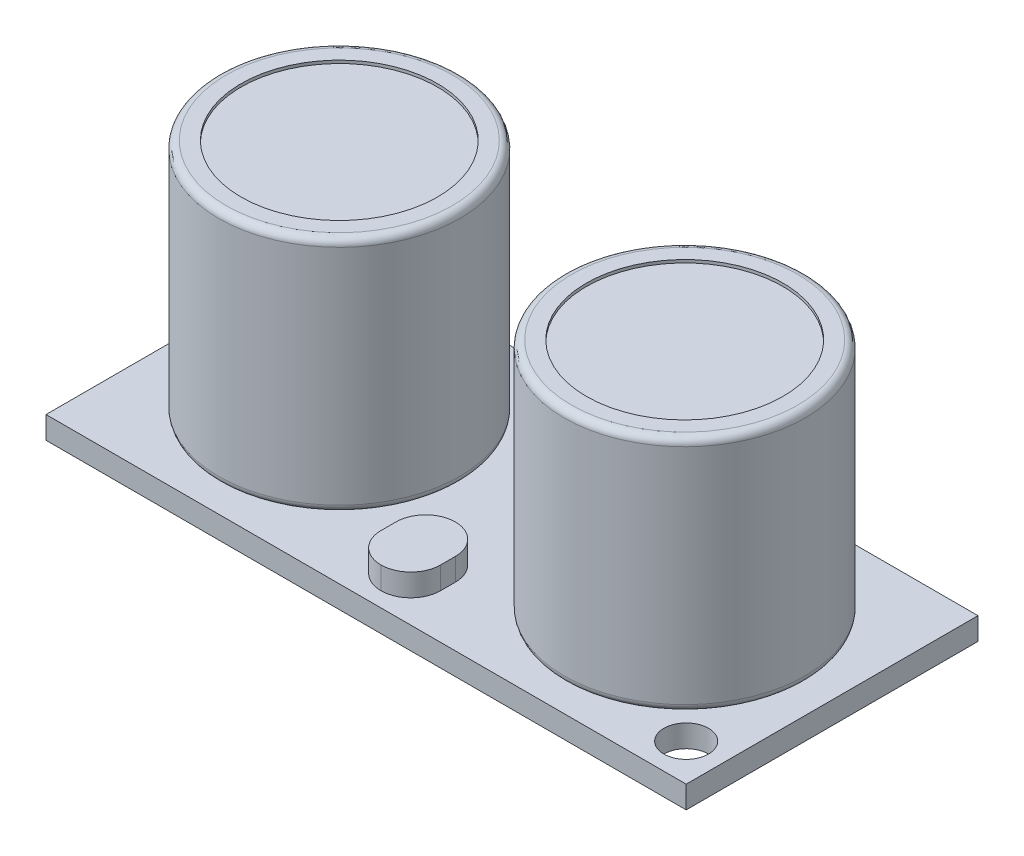
ISO-10303-21;
HEADER;
FILE_DESCRIPTION(('STEP AP214'),'2;1');
FILE_NAME('part.step','',(''),(''),'','','');
FILE_SCHEMA(('AUTOMOTIVE_DESIGN { 1 0 10303 214 1 1 1 1 }'));
ENDSEC;
DATA;
#1=APPLICATION_CONTEXT('core data for automotive mechanical design processes');
#2=APPLICATION_PROTOCOL_DEFINITION('international standard','automotive_design',2000,#1);
#3=PRODUCT_CONTEXT('',#1,'mechanical');
#4=PRODUCT('Part','Part','',(#3));
#5=PRODUCT_RELATED_PRODUCT_CATEGORY('part','',(#4));
#6=PRODUCT_DEFINITION_FORMATION('','',#4);
#7=PRODUCT_DEFINITION_CONTEXT('part definition',#1,'design');
#8=PRODUCT_DEFINITION('design','',#6,#7);
#9=PRODUCT_DEFINITION_SHAPE('','',#8);
#10=(LENGTH_UNIT() NAMED_UNIT(*) SI_UNIT(.MILLI.,.METRE.));
#11=(NAMED_UNIT(*) PLANE_ANGLE_UNIT() SI_UNIT($,.RADIAN.));
#12=(NAMED_UNIT(*) SI_UNIT($,.STERADIAN.) SOLID_ANGLE_UNIT());
#13=UNCERTAINTY_MEASURE_WITH_UNIT(LENGTH_MEASURE(1.E-05),#10,'distance_accuracy_value','');
#14=(GEOMETRIC_REPRESENTATION_CONTEXT(3) GLOBAL_UNCERTAINTY_ASSIGNED_CONTEXT((#13)) GLOBAL_UNIT_ASSIGNED_CONTEXT((#10,
#11,#12)) REPRESENTATION_CONTEXT('',''));
#15=CARTESIAN_POINT('',(0.,0.,0.));
#16=DIRECTION('',(0.,0.,1.));
#17=DIRECTION('',(1.,0.,0.));
#18=AXIS2_PLACEMENT_3D('',#15,#16,#17);
#19=CARTESIAN_POINT('',(-9.9,0.,-9.80000000000001));
#20=DIRECTION('',(0.,1.,0.));
#21=DIRECTION('',(0.,0.,1.));
#22=AXIS2_PLACEMENT_3D('',#19,#20,#21);
#23=PLANE('',#22);
#24=CARTESIAN_POINT('',(30.6,0.,7.3));
#25=DIRECTION('',(0.,-1.,0.));
#26=DIRECTION('',(0.,0.,-1.));
#27=AXIS2_PLACEMENT_3D('',#24,#25,#26);
#28=CIRCLE('',#27,1.5);
#29=CARTESIAN_POINT('',(30.6,0.,5.8));
#30=VERTEX_POINT('',#29);
#31=EDGE_CURVE('E247',#30,#30,#28,.T.);
#32=ORIENTED_EDGE('',*,*,#31,.T.);
#33=EDGE_LOOP('',(#32));
#34=FACE_BOUND('',#33,.T.);
#35=DIRECTION('',(0.,0.,-1.));
#36=VECTOR('',#35,1.);
#37=CARTESIAN_POINT('',(-9.9,0.,9.8));
#38=LINE('',#37,#36);
#39=CARTESIAN_POINT('',(-9.9,0.,9.8));
#40=VERTEX_POINT('',#39);
#41=CARTESIAN_POINT('',(-9.9,0.,-9.80000000000001));
#42=VERTEX_POINT('',#41);
#43=EDGE_CURVE('E116',#40,#42,#38,.T.);
#44=ORIENTED_EDGE('',*,*,#43,.F.);
#45=DIRECTION('',(-1.,0.,0.));
#46=VECTOR('',#45,1.);
#47=CARTESIAN_POINT('',(33.1,0.,9.8));
#48=LINE('',#47,#46);
#49=CARTESIAN_POINT('',(33.1,0.,9.8));
#50=VERTEX_POINT('',#49);
#51=EDGE_CURVE('E144',#50,#40,#48,.T.);
#52=ORIENTED_EDGE('',*,*,#51,.F.);
#53=DIRECTION('',(0.,0.,1.));
#54=VECTOR('',#53,1.);
#55=CARTESIAN_POINT('',(33.1,0.,9.8));
#56=LINE('',#55,#54);
#57=CARTESIAN_POINT('',(33.1,0.,-9.8));
#58=VERTEX_POINT('',#57);
#59=EDGE_CURVE('E117',#58,#50,#56,.T.);
#60=ORIENTED_EDGE('',*,*,#59,.F.);
#61=DIRECTION('',(1.,0.,0.));
#62=VECTOR('',#61,1.);
#63=CARTESIAN_POINT('',(33.1,0.,-9.8));
#64=LINE('',#63,#62);
#65=EDGE_CURVE('E111',#42,#58,#64,.T.);
#66=ORIENTED_EDGE('',*,*,#65,.F.);
#67=EDGE_LOOP('',(#44,#52,#60,#66));
#68=FACE_BOUND('',#67,.T.);
#69=CARTESIAN_POINT('',(-7.4,0.,-7.30000000000001));
#70=DIRECTION('',(0.,-1.,0.));
#71=DIRECTION('',(0.,0.,-1.));
#72=AXIS2_PLACEMENT_3D('',#69,#70,#71);
#73=CIRCLE('',#72,1.5);
#74=CARTESIAN_POINT('',(-7.4,0.,-8.80000000000001));
#75=VERTEX_POINT('',#74);
#76=EDGE_CURVE('E139',#75,#75,#73,.T.);
#77=ORIENTED_EDGE('',*,*,#76,.T.);
#78=EDGE_LOOP('',(#77));
#79=FACE_BOUND('',#78,.T.);
#80=CARTESIAN_POINT('',(0.,0.,0.));
#81=DIRECTION('',(0.,1.,0.));
#82=DIRECTION('',(0.,0.,1.));
#83=AXIS2_PLACEMENT_3D('',#80,#81,#82);
#84=CIRCLE('',#83,7.6);
#85=CARTESIAN_POINT('',(0.,0.,7.6));
#86=VERTEX_POINT('',#85);
#87=EDGE_CURVE('E169',#86,#86,#84,.F.);
#88=ORIENTED_EDGE('',*,*,#87,.T.);
#89=EDGE_LOOP('',(#88));
#90=FACE_BOUND('',#89,.T.);
#91=CARTESIAN_POINT('',(23.2,0.,0.));
#92=DIRECTION('',(0.,1.,0.));
#93=DIRECTION('',(0.,0.,1.));
#94=AXIS2_PLACEMENT_3D('',#91,#92,#93);
#95=CIRCLE('',#94,7.60000000000001);
#96=CARTESIAN_POINT('',(23.2,0.,7.60000000000001));
#97=VERTEX_POINT('',#96);
#98=EDGE_CURVE('E175',#97,#97,#95,.T.);
#99=ORIENTED_EDGE('',*,*,#98,.F.);
#100=EDGE_LOOP('',(#99));
#101=FACE_BOUND('',#100,.T.);
#102=DIRECTION('',(0.,0.,1.));
#103=VECTOR('',#102,1.);
#104=CARTESIAN_POINT('',(13.6,0.,0.));
#105=LINE('',#104,#103);
#106=CARTESIAN_POINT('',(13.6,0.,5.80000000000001));
#107=VERTEX_POINT('',#106);
#108=CARTESIAN_POINT('',(13.6,0.,6.80000000000001));
#109=VERTEX_POINT('',#108);
#110=EDGE_CURVE('E206',#107,#109,#105,.T.);
#111=ORIENTED_EDGE('',*,*,#110,.T.);
#112=CARTESIAN_POINT('',(11.6,0.,6.80000000000001));
#113=DIRECTION('',(0.,1.,0.));
#114=DIRECTION('',(0.,0.,1.));
#115=AXIS2_PLACEMENT_3D('',#112,#113,#114);
#116=CIRCLE('',#115,2.);
#117=CARTESIAN_POINT('',(11.6,0.,8.80000000000001));
#118=VERTEX_POINT('',#117);
#119=EDGE_CURVE('E11',#109,#118,#116,.F.);
#120=ORIENTED_EDGE('',*,*,#119,.T.);
#121=CARTESIAN_POINT('',(11.6,0.,6.80000000000001));
#122=DIRECTION('',(0.,1.,0.));
#123=DIRECTION('',(0.,0.,1.));
#124=AXIS2_PLACEMENT_3D('',#121,#122,#123);
#125=CIRCLE('',#124,2.);
#126=CARTESIAN_POINT('',(9.6,0.,6.80000000000001));
#127=VERTEX_POINT('',#126);
#128=EDGE_CURVE('E43',#118,#127,#125,.F.);
#129=ORIENTED_EDGE('',*,*,#128,.T.);
#130=DIRECTION('',(0.,0.,1.));
#131=VECTOR('',#130,1.);
#132=CARTESIAN_POINT('',(9.6,0.,0.));
#133=LINE('',#132,#131);
#134=CARTESIAN_POINT('',(9.6,0.,5.80000000000001));
#135=VERTEX_POINT('',#134);
#136=EDGE_CURVE('E201',#135,#127,#133,.T.);
#137=ORIENTED_EDGE('',*,*,#136,.F.);
#138=CARTESIAN_POINT('',(11.6,0.,5.80000000000001));
#139=DIRECTION('',(0.,1.,0.));
#140=DIRECTION('',(0.,0.,1.));
#141=AXIS2_PLACEMENT_3D('',#138,#139,#140);
#142=CIRCLE('',#141,2.);
#143=CARTESIAN_POINT('',(11.6,0.,3.80000000000001));
#144=VERTEX_POINT('',#143);
#145=EDGE_CURVE('E56',#135,#144,#142,.F.);
#146=ORIENTED_EDGE('',*,*,#145,.T.);
#147=CARTESIAN_POINT('',(11.6,0.,5.80000000000001));
#148=DIRECTION('',(0.,1.,0.));
#149=DIRECTION('',(0.,0.,1.));
#150=AXIS2_PLACEMENT_3D('',#147,#148,#149);
#151=CIRCLE('',#150,2.);
#152=EDGE_CURVE('E197',#144,#107,#151,.F.);
#153=ORIENTED_EDGE('',*,*,#152,.T.);
#154=EDGE_LOOP('',(#111,#120,#129,#137,#146,#153));
#155=FACE_BOUND('',#154,.T.);
#156=ADVANCED_FACE('F34',(#34,#68,#79,#90,#101,#155),#23,.T.);
#157=CARTESIAN_POINT('',(0.,16.,0.));
#158=DIRECTION('',(0.,-1.,0.));
#159=DIRECTION('',(0.,0.,-1.));
#160=AXIS2_PLACEMENT_3D('',#157,#158,#159);
#161=CYLINDRICAL_SURFACE('',#160,8.1);
#162=CARTESIAN_POINT('',(0.,0.5,0.));
#163=DIRECTION('',(0.,1.,0.));
#164=DIRECTION('',(0.,0.,1.));
#165=AXIS2_PLACEMENT_3D('',#162,#163,#164);
#166=CIRCLE('',#165,8.1);
#167=CARTESIAN_POINT('',(0.,0.5,8.1));
#168=VERTEX_POINT('',#167);
#169=EDGE_CURVE('E166',#168,#168,#166,.T.);
#170=ORIENTED_EDGE('',*,*,#169,.T.);
#171=EDGE_LOOP('',(#170));
#172=FACE_BOUND('',#171,.T.);
#173=CARTESIAN_POINT('',(0.,15.5,0.));
#174=DIRECTION('',(0.,1.,0.));
#175=DIRECTION('',(0.,0.,1.));
#176=AXIS2_PLACEMENT_3D('',#173,#174,#175);
#177=CIRCLE('',#176,8.1);
#178=CARTESIAN_POINT('',(0.,15.5,8.1));
#179=VERTEX_POINT('',#178);
#180=EDGE_CURVE('E163',#179,#179,#177,.F.);
#181=ORIENTED_EDGE('',*,*,#180,.T.);
#182=EDGE_LOOP('',(#181));
#183=FACE_BOUND('',#182,.T.);
#184=ADVANCED_FACE('F274',(#172,#183),#161,.T.);
#185=CARTESIAN_POINT('',(0.,16.,0.));
#186=DIRECTION('',(0.,1.,0.));
#187=DIRECTION('',(0.,0.,1.));
#188=AXIS2_PLACEMENT_3D('',#185,#186,#187);
#189=PLANE('',#188);
#190=CARTESIAN_POINT('',(0.,16.,0.));
#191=DIRECTION('',(0.,1.,0.));
#192=DIRECTION('',(0.,0.,1.));
#193=AXIS2_PLACEMENT_3D('',#190,#191,#192);
#194=CIRCLE('',#193,6.6);
#195=CARTESIAN_POINT('',(0.,16.,6.6));
#196=VERTEX_POINT('',#195);
#197=EDGE_CURVE('E129',#196,#196,#194,.T.);
#198=ORIENTED_EDGE('',*,*,#197,.F.);
#199=EDGE_LOOP('',(#198));
#200=FACE_BOUND('',#199,.T.);
#201=CARTESIAN_POINT('',(0.,16.,0.));
#202=DIRECTION('',(0.,1.,0.));
#203=DIRECTION('',(0.,0.,1.));
#204=AXIS2_PLACEMENT_3D('',#201,#202,#203);
#205=CIRCLE('',#204,7.6);
#206=CARTESIAN_POINT('',(0.,16.,7.6));
#207=VERTEX_POINT('',#206);
#208=EDGE_CURVE('E172',#207,#207,#205,.T.);
#209=ORIENTED_EDGE('',*,*,#208,.T.);
#210=EDGE_LOOP('',(#209));
#211=FACE_BOUND('',#210,.T.);
#212=ADVANCED_FACE('F279',(#200,#211),#189,.T.);
#213=CARTESIAN_POINT('',(0.,0.5,0.));
#214=DIRECTION('',(0.,1.,0.));
#215=DIRECTION('',(0.,0.,1.));
#216=AXIS2_PLACEMENT_3D('',#213,#214,#215);
#217=TOROIDAL_SURFACE('',#216,7.6,0.5);
#218=ORIENTED_EDGE('',*,*,#87,.F.);
#219=EDGE_LOOP('',(#218));
#220=FACE_BOUND('',#219,.T.);
#221=ORIENTED_EDGE('',*,*,#169,.F.);
#222=EDGE_LOOP('',(#221));
#223=FACE_BOUND('',#222,.T.);
#224=ADVANCED_FACE('F305',(#220,#223),#217,.T.);
#225=CARTESIAN_POINT('',(0.,15.5,0.));
#226=DIRECTION('',(0.,1.,0.));
#227=DIRECTION('',(0.,0.,1.));
#228=AXIS2_PLACEMENT_3D('',#225,#226,#227);
#229=TOROIDAL_SURFACE('',#228,7.6,0.5);
#230=ORIENTED_EDGE('',*,*,#180,.F.);
#231=EDGE_LOOP('',(#230));
#232=FACE_BOUND('',#231,.T.);
#233=ORIENTED_EDGE('',*,*,#208,.F.);
#234=EDGE_LOOP('',(#233));
#235=FACE_BOUND('',#234,.T.);
#236=ADVANCED_FACE('F301',(#232,#235),#229,.T.);
#237=CARTESIAN_POINT('',(0.,15.8,0.));
#238=DIRECTION('',(0.,1.,0.));
#239=DIRECTION('',(0.,0.,1.));
#240=AXIS2_PLACEMENT_3D('',#237,#238,#239);
#241=CYLINDRICAL_SURFACE('',#240,6.6);
#242=CARTESIAN_POINT('',(0.,15.8,0.));
#243=DIRECTION('',(0.,1.,0.));
#244=DIRECTION('',(0.,0.,1.));
#245=AXIS2_PLACEMENT_3D('',#242,#243,#244);
#246=CIRCLE('',#245,6.6);
#247=CARTESIAN_POINT('',(0.,15.8,6.6));
#248=VERTEX_POINT('',#247);
#249=EDGE_CURVE('E160',#248,#248,#246,.T.);
#250=ORIENTED_EDGE('',*,*,#249,.F.);
#251=EDGE_LOOP('',(#250));
#252=FACE_BOUND('',#251,.T.);
#253=ORIENTED_EDGE('',*,*,#197,.T.);
#254=EDGE_LOOP('',(#253));
#255=FACE_BOUND('',#254,.T.);
#256=ADVANCED_FACE('F297',(#252,#255),#241,.F.);
#257=CARTESIAN_POINT('',(0.,15.8,0.));
#258=DIRECTION('',(0.,1.,0.));
#259=DIRECTION('',(0.,0.,1.));
#260=AXIS2_PLACEMENT_3D('',#257,#258,#259);
#261=PLANE('',#260);
#262=ORIENTED_EDGE('',*,*,#249,.T.);
#263=EDGE_LOOP('',(#262));
#264=FACE_BOUND('',#263,.T.);
#265=ADVANCED_FACE('F285',(#264),#261,.T.);
#266=CARTESIAN_POINT('',(-9.9,-1.5,-9.80000000000001));
#267=DIRECTION('',(0.,1.,0.));
#268=DIRECTION('',(0.,0.,1.));
#269=AXIS2_PLACEMENT_3D('',#266,#267,#268);
#270=PLANE('',#269);
#271=CARTESIAN_POINT('',(-7.4,-1.5,-7.30000000000001));
#272=DIRECTION('',(0.,-1.,0.));
#273=DIRECTION('',(0.,0.,-1.));
#274=AXIS2_PLACEMENT_3D('',#271,#272,#273);
#275=CIRCLE('',#274,1.5);
#276=CARTESIAN_POINT('',(-7.4,-1.5,-8.80000000000001));
#277=VERTEX_POINT('',#276);
#278=EDGE_CURVE('E136',#277,#277,#275,.T.);
#279=ORIENTED_EDGE('',*,*,#278,.F.);
#280=EDGE_LOOP('',(#279));
#281=FACE_BOUND('',#280,.T.);
#282=DIRECTION('',(0.,0.,-1.));
#283=VECTOR('',#282,1.);
#284=CARTESIAN_POINT('',(-9.9,-1.5,9.8));
#285=LINE('',#284,#283);
#286=CARTESIAN_POINT('',(-9.9,-1.5,9.8));
#287=VERTEX_POINT('',#286);
#288=CARTESIAN_POINT('',(-9.9,-1.5,-9.80000000000001));
#289=VERTEX_POINT('',#288);
#290=EDGE_CURVE('E146',#287,#289,#285,.T.);
#291=ORIENTED_EDGE('',*,*,#290,.T.);
#292=DIRECTION('',(1.,0.,0.));
#293=VECTOR('',#292,1.);
#294=CARTESIAN_POINT('',(33.1,-1.5,-9.8));
#295=LINE('',#294,#293);
#296=CARTESIAN_POINT('',(33.1,-1.5,-9.8));
#297=VERTEX_POINT('',#296);
#298=EDGE_CURVE('E125',#289,#297,#295,.T.);
#299=ORIENTED_EDGE('',*,*,#298,.T.);
#300=DIRECTION('',(0.,0.,1.));
#301=VECTOR('',#300,1.);
#302=CARTESIAN_POINT('',(33.1,-1.5,9.8));
#303=LINE('',#302,#301);
#304=CARTESIAN_POINT('',(33.1,-1.5,9.8));
#305=VERTEX_POINT('',#304);
#306=EDGE_CURVE('E149',#297,#305,#303,.T.);
#307=ORIENTED_EDGE('',*,*,#306,.T.);
#308=DIRECTION('',(-1.,0.,0.));
#309=VECTOR('',#308,1.);
#310=CARTESIAN_POINT('',(33.1,-1.5,9.8));
#311=LINE('',#310,#309);
#312=EDGE_CURVE('E151',#305,#287,#311,.T.);
#313=ORIENTED_EDGE('',*,*,#312,.T.);
#314=EDGE_LOOP('',(#291,#299,#307,#313));
#315=FACE_BOUND('',#314,.T.);
#316=CARTESIAN_POINT('',(30.6,-1.5,7.3));
#317=DIRECTION('',(0.,-1.,0.));
#318=DIRECTION('',(0.,0.,-1.));
#319=AXIS2_PLACEMENT_3D('',#316,#317,#318);
#320=CIRCLE('',#319,1.5);
#321=CARTESIAN_POINT('',(30.6,-1.5,5.8));
#322=VERTEX_POINT('',#321);
#323=EDGE_CURVE('E250',#322,#322,#320,.T.);
#324=ORIENTED_EDGE('',*,*,#323,.F.);
#325=EDGE_LOOP('',(#324));
#326=FACE_BOUND('',#325,.T.);
#327=ADVANCED_FACE('F283',(#281,#315,#326),#270,.F.);
#328=CARTESIAN_POINT('',(-9.9,-1.5,9.8));
#329=DIRECTION('',(1.,0.,0.));
#330=DIRECTION('',(0.,0.,-1.));
#331=AXIS2_PLACEMENT_3D('',#328,#329,#330);
#332=PLANE('',#331);
#333=ORIENTED_EDGE('',*,*,#43,.T.);
#334=DIRECTION('',(0.,1.,0.));
#335=VECTOR('',#334,1.);
#336=CARTESIAN_POINT('',(-9.9,-1.5,-9.80000000000001));
#337=LINE('',#336,#335);
#338=EDGE_CURVE('E123',#289,#42,#337,.T.);
#339=ORIENTED_EDGE('',*,*,#338,.F.);
#340=ORIENTED_EDGE('',*,*,#290,.F.);
#341=DIRECTION('',(0.,1.,0.));
#342=VECTOR('',#341,1.);
#343=CARTESIAN_POINT('',(-9.9,-1.5,9.8));
#344=LINE('',#343,#342);
#345=EDGE_CURVE('E135',#287,#40,#344,.T.);
#346=ORIENTED_EDGE('',*,*,#345,.T.);
#347=EDGE_LOOP('',(#333,#339,#340,#346));
#348=FACE_BOUND('',#347,.T.);
#349=ADVANCED_FACE('F133',(#348),#332,.F.);
#350=CARTESIAN_POINT('',(33.1,-1.5,-9.8));
#351=DIRECTION('',(0.,0.,1.));
#352=DIRECTION('',(1.,0.,0.));
#353=AXIS2_PLACEMENT_3D('',#350,#351,#352);
#354=PLANE('',#353);
#355=ORIENTED_EDGE('',*,*,#65,.T.);
#356=DIRECTION('',(0.,1.,0.));
#357=VECTOR('',#356,1.);
#358=CARTESIAN_POINT('',(33.1,-1.5,-9.8));
#359=LINE('',#358,#357);
#360=EDGE_CURVE('E130',#297,#58,#359,.T.);
#361=ORIENTED_EDGE('',*,*,#360,.F.);
#362=ORIENTED_EDGE('',*,*,#298,.F.);
#363=ORIENTED_EDGE('',*,*,#338,.T.);
#364=EDGE_LOOP('',(#355,#361,#362,#363));
#365=FACE_BOUND('',#364,.T.);
#366=ADVANCED_FACE('F124',(#365),#354,.F.);
#367=CARTESIAN_POINT('',(33.1,-1.5,9.8));
#368=DIRECTION('',(-1.,0.,0.));
#369=DIRECTION('',(0.,0.,1.));
#370=AXIS2_PLACEMENT_3D('',#367,#368,#369);
#371=PLANE('',#370);
#372=ORIENTED_EDGE('',*,*,#59,.T.);
#373=DIRECTION('',(0.,1.,0.));
#374=VECTOR('',#373,1.);
#375=CARTESIAN_POINT('',(33.1,-1.5,9.8));
#376=LINE('',#375,#374);
#377=EDGE_CURVE('E154',#305,#50,#376,.T.);
#378=ORIENTED_EDGE('',*,*,#377,.F.);
#379=ORIENTED_EDGE('',*,*,#306,.F.);
#380=ORIENTED_EDGE('',*,*,#360,.T.);
#381=EDGE_LOOP('',(#372,#378,#379,#380));
#382=FACE_BOUND('',#381,.T.);
#383=ADVANCED_FACE('F269',(#382),#371,.F.);
#384=CARTESIAN_POINT('',(33.1,-1.5,9.8));
#385=DIRECTION('',(0.,0.,-1.));
#386=DIRECTION('',(-1.,0.,0.));
#387=AXIS2_PLACEMENT_3D('',#384,#385,#386);
#388=PLANE('',#387);
#389=ORIENTED_EDGE('',*,*,#51,.T.);
#390=ORIENTED_EDGE('',*,*,#345,.F.);
#391=ORIENTED_EDGE('',*,*,#312,.F.);
#392=ORIENTED_EDGE('',*,*,#377,.T.);
#393=EDGE_LOOP('',(#389,#390,#391,#392));
#394=FACE_BOUND('',#393,.T.);
#395=ADVANCED_FACE('F259',(#394),#388,.F.);
#396=CARTESIAN_POINT('',(-7.4,-1.5,-7.30000000000001));
#397=DIRECTION('',(0.,1.,0.));
#398=DIRECTION('',(0.,0.,1.));
#399=AXIS2_PLACEMENT_3D('',#396,#397,#398);
#400=CYLINDRICAL_SURFACE('',#399,1.5);
#401=ORIENTED_EDGE('',*,*,#278,.T.);
#402=EDGE_LOOP('',(#401));
#403=FACE_BOUND('',#402,.T.);
#404=ORIENTED_EDGE('',*,*,#76,.F.);
#405=EDGE_LOOP('',(#404));
#406=FACE_BOUND('',#405,.T.);
#407=ADVANCED_FACE('F256',(#403,#406),#400,.F.);
#408=CARTESIAN_POINT('',(30.6,-1.5,7.3));
#409=DIRECTION('',(0.,1.,0.));
#410=DIRECTION('',(0.,0.,1.));
#411=AXIS2_PLACEMENT_3D('',#408,#409,#410);
#412=CYLINDRICAL_SURFACE('',#411,1.5);
#413=ORIENTED_EDGE('',*,*,#323,.T.);
#414=EDGE_LOOP('',(#413));
#415=FACE_BOUND('',#414,.T.);
#416=ORIENTED_EDGE('',*,*,#31,.F.);
#417=EDGE_LOOP('',(#416));
#418=FACE_BOUND('',#417,.T.);
#419=ADVANCED_FACE('F258',(#415,#418),#412,.F.);
#420=CARTESIAN_POINT('',(23.2,16.,0.));
#421=DIRECTION('',(0.,-1.,0.));
#422=DIRECTION('',(0.,0.,-1.));
#423=AXIS2_PLACEMENT_3D('',#420,#421,#422);
#424=CYLINDRICAL_SURFACE('',#423,8.10000000000001);
#425=CARTESIAN_POINT('',(23.2,0.5,0.));
#426=DIRECTION('',(0.,1.,0.));
#427=DIRECTION('',(0.,0.,1.));
#428=AXIS2_PLACEMENT_3D('',#425,#426,#427);
#429=CIRCLE('',#428,8.10000000000001);
#430=CARTESIAN_POINT('',(23.2,0.5,8.10000000000001));
#431=VERTEX_POINT('',#430);
#432=EDGE_CURVE('E241',#431,#431,#429,.T.);
#433=ORIENTED_EDGE('',*,*,#432,.T.);
#434=EDGE_LOOP('',(#433));
#435=FACE_BOUND('',#434,.T.);
#436=CARTESIAN_POINT('',(23.2,15.5,0.));
#437=DIRECTION('',(0.,1.,0.));
#438=DIRECTION('',(0.,0.,1.));
#439=AXIS2_PLACEMENT_3D('',#436,#437,#438);
#440=CIRCLE('',#439,8.10000000000001);
#441=CARTESIAN_POINT('',(23.2,15.5,8.10000000000001));
#442=VERTEX_POINT('',#441);
#443=EDGE_CURVE('E238',#442,#442,#440,.F.);
#444=ORIENTED_EDGE('',*,*,#443,.T.);
#445=EDGE_LOOP('',(#444));
#446=FACE_BOUND('',#445,.T.);
#447=ADVANCED_FACE('F266',(#435,#446),#424,.T.);
#448=CARTESIAN_POINT('',(23.2,16.,0.));
#449=DIRECTION('',(0.,1.,0.));
#450=DIRECTION('',(0.,0.,1.));
#451=AXIS2_PLACEMENT_3D('',#448,#449,#450);
#452=PLANE('',#451);
#453=CARTESIAN_POINT('',(23.2,16.,0.));
#454=DIRECTION('',(0.,1.,0.));
#455=DIRECTION('',(0.,0.,1.));
#456=AXIS2_PLACEMENT_3D('',#453,#454,#455);
#457=CIRCLE('',#456,7.60000000000001);
#458=CARTESIAN_POINT('',(23.2,16.,7.60000000000001));
#459=VERTEX_POINT('',#458);
#460=EDGE_CURVE('E244',#459,#459,#457,.T.);
#461=ORIENTED_EDGE('',*,*,#460,.T.);
#462=EDGE_LOOP('',(#461));
#463=FACE_BOUND('',#462,.T.);
#464=CARTESIAN_POINT('',(23.2,16.,0.));
#465=DIRECTION('',(0.,1.,0.));
#466=DIRECTION('',(0.,0.,1.));
#467=AXIS2_PLACEMENT_3D('',#464,#465,#466);
#468=CIRCLE('',#467,6.6);
#469=CARTESIAN_POINT('',(23.2,16.,6.6));
#470=VERTEX_POINT('',#469);
#471=EDGE_CURVE('E227',#470,#470,#468,.T.);
#472=ORIENTED_EDGE('',*,*,#471,.F.);
#473=EDGE_LOOP('',(#472));
#474=FACE_BOUND('',#473,.T.);
#475=ADVANCED_FACE('F385',(#463,#474),#452,.T.);
#476=CARTESIAN_POINT('',(23.2,15.8,0.));
#477=DIRECTION('',(0.,1.,0.));
#478=DIRECTION('',(0.,0.,1.));
#479=AXIS2_PLACEMENT_3D('',#476,#477,#478);
#480=CYLINDRICAL_SURFACE('',#479,6.6);
#481=CARTESIAN_POINT('',(23.2,15.8,0.));
#482=DIRECTION('',(0.,1.,0.));
#483=DIRECTION('',(0.,0.,1.));
#484=AXIS2_PLACEMENT_3D('',#481,#482,#483);
#485=CIRCLE('',#484,6.6);
#486=CARTESIAN_POINT('',(23.2,15.8,6.6));
#487=VERTEX_POINT('',#486);
#488=EDGE_CURVE('E231',#487,#487,#485,.T.);
#489=ORIENTED_EDGE('',*,*,#488,.F.);
#490=EDGE_LOOP('',(#489));
#491=FACE_BOUND('',#490,.T.);
#492=ORIENTED_EDGE('',*,*,#471,.T.);
#493=EDGE_LOOP('',(#492));
#494=FACE_BOUND('',#493,.T.);
#495=ADVANCED_FACE('F377',(#491,#494),#480,.F.);
#496=CARTESIAN_POINT('',(23.2,15.8,0.));
#497=DIRECTION('',(0.,1.,0.));
#498=DIRECTION('',(0.,0.,1.));
#499=AXIS2_PLACEMENT_3D('',#496,#497,#498);
#500=PLANE('',#499);
#501=ORIENTED_EDGE('',*,*,#488,.T.);
#502=EDGE_LOOP('',(#501));
#503=FACE_BOUND('',#502,.T.);
#504=ADVANCED_FACE('F368',(#503),#500,.T.);
#505=CARTESIAN_POINT('',(23.2,0.5,0.));
#506=DIRECTION('',(0.,1.,0.));
#507=DIRECTION('',(0.,0.,1.));
#508=AXIS2_PLACEMENT_3D('',#505,#506,#507);
#509=TOROIDAL_SURFACE('',#508,7.60000000000001,0.5);
#510=ORIENTED_EDGE('',*,*,#98,.T.);
#511=EDGE_LOOP('',(#510));
#512=FACE_BOUND('',#511,.T.);
#513=ORIENTED_EDGE('',*,*,#432,.F.);
#514=EDGE_LOOP('',(#513));
#515=FACE_BOUND('',#514,.T.);
#516=ADVANCED_FACE('F360',(#512,#515),#509,.T.);
#517=CARTESIAN_POINT('',(23.2,15.5,0.));
#518=DIRECTION('',(0.,1.,0.));
#519=DIRECTION('',(0.,0.,1.));
#520=AXIS2_PLACEMENT_3D('',#517,#518,#519);
#521=TOROIDAL_SURFACE('',#520,7.60000000000001,0.5);
#522=ORIENTED_EDGE('',*,*,#443,.F.);
#523=EDGE_LOOP('',(#522));
#524=FACE_BOUND('',#523,.T.);
#525=ORIENTED_EDGE('',*,*,#460,.F.);
#526=EDGE_LOOP('',(#525));
#527=FACE_BOUND('',#526,.T.);
#528=ADVANCED_FACE('F352',(#524,#527),#521,.T.);
#529=CARTESIAN_POINT('',(9.6,1.5,0.));
#530=DIRECTION('',(1.,0.,0.));
#531=DIRECTION('',(0.,0.,-1.));
#532=AXIS2_PLACEMENT_3D('',#529,#530,#531);
#533=PLANE('',#532);
#534=DIRECTION('',(0.,0.,1.));
#535=VECTOR('',#534,1.);
#536=CARTESIAN_POINT('',(9.6,1.5,0.));
#537=LINE('',#536,#535);
#538=CARTESIAN_POINT('',(9.6,1.5,5.80000000000001));
#539=VERTEX_POINT('',#538);
#540=CARTESIAN_POINT('',(9.6,1.5,6.80000000000001));
#541=VERTEX_POINT('',#540);
#542=EDGE_CURVE('E228',#539,#541,#537,.T.);
#543=ORIENTED_EDGE('',*,*,#542,.F.);
#544=DIRECTION('',(0.,-1.,0.));
#545=VECTOR('',#544,1.);
#546=CARTESIAN_POINT('',(9.6,0.,5.80000000000001));
#547=LINE('',#546,#545);
#548=EDGE_CURVE('E181',#539,#135,#547,.T.);
#549=ORIENTED_EDGE('',*,*,#548,.T.);
#550=ORIENTED_EDGE('',*,*,#136,.T.);
#551=DIRECTION('',(0.,-1.,0.));
#552=VECTOR('',#551,1.);
#553=CARTESIAN_POINT('',(9.6,1.5,6.80000000000001));
#554=LINE('',#553,#552);
#555=EDGE_CURVE('E178',#127,#541,#554,.F.);
#556=ORIENTED_EDGE('',*,*,#555,.T.);
#557=EDGE_LOOP('',(#543,#549,#550,#556));
#558=FACE_BOUND('',#557,.T.);
#559=ADVANCED_FACE('F345',(#558),#533,.F.);
#560=CARTESIAN_POINT('',(13.6,1.5,0.));
#561=DIRECTION('',(1.,0.,0.));
#562=DIRECTION('',(0.,0.,-1.));
#563=AXIS2_PLACEMENT_3D('',#560,#561,#562);
#564=PLANE('',#563);
#565=ORIENTED_EDGE('',*,*,#110,.F.);
#566=DIRECTION('',(0.,-1.,0.));
#567=VECTOR('',#566,1.);
#568=CARTESIAN_POINT('',(13.6,1.5,5.80000000000001));
#569=LINE('',#568,#567);
#570=CARTESIAN_POINT('',(13.6,1.5,5.80000000000001));
#571=VERTEX_POINT('',#570);
#572=EDGE_CURVE('E194',#107,#571,#569,.F.);
#573=ORIENTED_EDGE('',*,*,#572,.T.);
#574=DIRECTION('',(0.,0.,1.));
#575=VECTOR('',#574,1.);
#576=CARTESIAN_POINT('',(13.6,1.5,0.));
#577=LINE('',#576,#575);
#578=CARTESIAN_POINT('',(13.6,1.5,6.80000000000001));
#579=VERTEX_POINT('',#578);
#580=EDGE_CURVE('E220',#571,#579,#577,.T.);
#581=ORIENTED_EDGE('',*,*,#580,.T.);
#582=DIRECTION('',(0.,-1.,0.));
#583=VECTOR('',#582,1.);
#584=CARTESIAN_POINT('',(13.6,0.,6.80000000000001));
#585=LINE('',#584,#583);
#586=EDGE_CURVE('E192',#579,#109,#585,.T.);
#587=ORIENTED_EDGE('',*,*,#586,.T.);
#588=EDGE_LOOP('',(#565,#573,#581,#587));
#589=FACE_BOUND('',#588,.T.);
#590=ADVANCED_FACE('F225',(#589),#564,.T.);
#591=CARTESIAN_POINT('',(-25.2982139257747,1.5,0.));
#592=DIRECTION('',(0.,1.,0.));
#593=DIRECTION('',(0.,0.,1.));
#594=AXIS2_PLACEMENT_3D('',#591,#592,#593);
#595=PLANE('',#594);
#596=CARTESIAN_POINT('',(11.6,1.5,5.80000000000001));
#597=DIRECTION('',(0.,1.,0.));
#598=DIRECTION('',(0.,0.,1.));
#599=AXIS2_PLACEMENT_3D('',#596,#597,#598);
#600=CIRCLE('',#599,2.);
#601=CARTESIAN_POINT('',(11.6,1.5,3.80000000000001));
#602=VERTEX_POINT('',#601);
#603=EDGE_CURVE('E188',#571,#602,#600,.T.);
#604=ORIENTED_EDGE('',*,*,#603,.T.);
#605=CARTESIAN_POINT('',(11.6,1.5,5.80000000000001));
#606=DIRECTION('',(0.,1.,0.));
#607=DIRECTION('',(0.,0.,1.));
#608=AXIS2_PLACEMENT_3D('',#605,#606,#607);
#609=CIRCLE('',#608,2.);
#610=EDGE_CURVE('E190',#602,#539,#609,.T.);
#611=ORIENTED_EDGE('',*,*,#610,.T.);
#612=ORIENTED_EDGE('',*,*,#542,.T.);
#613=CARTESIAN_POINT('',(11.6,1.5,6.80000000000001));
#614=DIRECTION('',(0.,1.,0.));
#615=DIRECTION('',(0.,0.,1.));
#616=AXIS2_PLACEMENT_3D('',#613,#614,#615);
#617=CIRCLE('',#616,2.);
#618=CARTESIAN_POINT('',(11.6,1.5,8.80000000000001));
#619=VERTEX_POINT('',#618);
#620=EDGE_CURVE('E186',#541,#619,#617,.T.);
#621=ORIENTED_EDGE('',*,*,#620,.T.);
#622=CARTESIAN_POINT('',(11.6,1.5,6.80000000000001));
#623=DIRECTION('',(0.,1.,0.));
#624=DIRECTION('',(0.,0.,1.));
#625=AXIS2_PLACEMENT_3D('',#622,#623,#624);
#626=CIRCLE('',#625,2.);
#627=EDGE_CURVE('E184',#619,#579,#626,.T.);
#628=ORIENTED_EDGE('',*,*,#627,.T.);
#629=ORIENTED_EDGE('',*,*,#580,.F.);
#630=EDGE_LOOP('',(#604,#611,#612,#621,#628,#629));
#631=FACE_BOUND('',#630,.T.);
#632=ADVANCED_FACE('F219',(#631),#595,.T.);
#633=CARTESIAN_POINT('',(11.6,1.5,5.80000000000001));
#634=DIRECTION('',(0.,-1.,0.));
#635=DIRECTION('',(0.,0.,-1.));
#636=AXIS2_PLACEMENT_3D('',#633,#634,#635);
#637=CYLINDRICAL_SURFACE('',#636,2.);
#638=DIRECTION('',(0.,-1.,0.));
#639=VECTOR('',#638,1.);
#640=CARTESIAN_POINT('',(11.6,1.5,3.80000000000001));
#641=LINE('',#640,#639);
#642=EDGE_CURVE('E199',#602,#144,#641,.T.);
#643=ORIENTED_EDGE('',*,*,#642,.F.);
#644=ORIENTED_EDGE('',*,*,#603,.F.);
#645=ORIENTED_EDGE('',*,*,#572,.F.);
#646=ORIENTED_EDGE('',*,*,#152,.F.);
#647=EDGE_LOOP('',(#643,#644,#645,#646));
#648=FACE_BOUND('',#647,.T.);
#649=ADVANCED_FACE('F316',(#648),#637,.T.);
#650=CARTESIAN_POINT('',(11.6,1.5,5.80000000000001));
#651=DIRECTION('',(0.,1.,0.));
#652=DIRECTION('',(0.,0.,1.));
#653=AXIS2_PLACEMENT_3D('',#650,#651,#652);
#654=CYLINDRICAL_SURFACE('',#653,2.);
#655=ORIENTED_EDGE('',*,*,#610,.F.);
#656=ORIENTED_EDGE('',*,*,#642,.T.);
#657=ORIENTED_EDGE('',*,*,#145,.F.);
#658=ORIENTED_EDGE('',*,*,#548,.F.);
#659=EDGE_LOOP('',(#655,#656,#657,#658));
#660=FACE_BOUND('',#659,.T.);
#661=ADVANCED_FACE('F313',(#660),#654,.T.);
#662=CARTESIAN_POINT('',(11.6,1.5,6.80000000000001));
#663=DIRECTION('',(0.,1.,0.));
#664=DIRECTION('',(0.,0.,1.));
#665=AXIS2_PLACEMENT_3D('',#662,#663,#664);
#666=CYLINDRICAL_SURFACE('',#665,2.);
#667=ORIENTED_EDGE('',*,*,#586,.F.);
#668=ORIENTED_EDGE('',*,*,#627,.F.);
#669=DIRECTION('',(0.,-1.,0.));
#670=VECTOR('',#669,1.);
#671=CARTESIAN_POINT('',(11.6,1.5,8.80000000000001));
#672=LINE('',#671,#670);
#673=EDGE_CURVE('E38',#118,#619,#672,.F.);
#674=ORIENTED_EDGE('',*,*,#673,.F.);
#675=ORIENTED_EDGE('',*,*,#119,.F.);
#676=EDGE_LOOP('',(#667,#668,#674,#675));
#677=FACE_BOUND('',#676,.T.);
#678=ADVANCED_FACE('F36',(#677),#666,.T.);
#679=CARTESIAN_POINT('',(11.6,1.5,6.80000000000001));
#680=DIRECTION('',(0.,-1.,0.));
#681=DIRECTION('',(0.,0.,-1.));
#682=AXIS2_PLACEMENT_3D('',#679,#680,#681);
#683=CYLINDRICAL_SURFACE('',#682,2.);
#684=ORIENTED_EDGE('',*,*,#620,.F.);
#685=ORIENTED_EDGE('',*,*,#555,.F.);
#686=ORIENTED_EDGE('',*,*,#128,.F.);
#687=ORIENTED_EDGE('',*,*,#673,.T.);
#688=EDGE_LOOP('',(#684,#685,#686,#687));
#689=FACE_BOUND('',#688,.T.);
#690=ADVANCED_FACE('F211',(#689),#683,.T.);
#691=CLOSED_SHELL('',(#156,#184,#212,#224,#236,#256,#265,#327,#349,#366,#383,#395,#407,#419,
#447,#475,#495,#504,#516,#528,#559,#590,#632,#649,#661,#678,#690));
#692=MANIFOLD_SOLID_BREP('B2',#691);
#693=ADVANCED_BREP_SHAPE_REPRESENTATION('',(#18,#692),#14);
#694=SHAPE_DEFINITION_REPRESENTATION(#9,#693);
ENDSEC;
END-ISO-10303-21;
